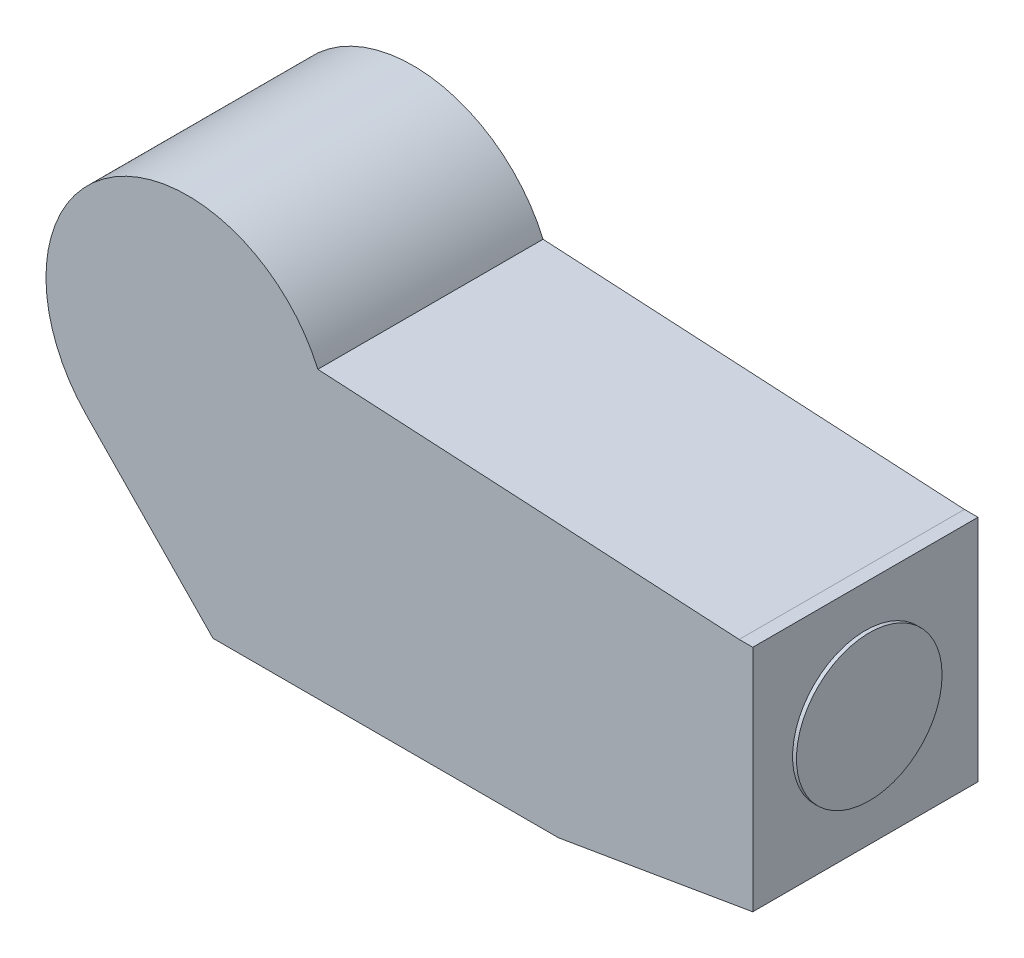
ISO-10303-21;
HEADER;
FILE_DESCRIPTION(('STEP AP214'),'2;1');
FILE_NAME('part.step','',(''),(''),'','','');
FILE_SCHEMA(('AUTOMOTIVE_DESIGN { 1 0 10303 214 1 1 1 1 }'));
ENDSEC;
DATA;
#1=APPLICATION_CONTEXT('core data for automotive mechanical design processes');
#2=APPLICATION_PROTOCOL_DEFINITION('international standard','automotive_design',2000,#1);
#3=PRODUCT_CONTEXT('',#1,'mechanical');
#4=PRODUCT('Part','Part','',(#3));
#5=PRODUCT_RELATED_PRODUCT_CATEGORY('part','',(#4));
#6=PRODUCT_DEFINITION_FORMATION('','',#4);
#7=PRODUCT_DEFINITION_CONTEXT('part definition',#1,'design');
#8=PRODUCT_DEFINITION('design','',#6,#7);
#9=PRODUCT_DEFINITION_SHAPE('','',#8);
#10=(LENGTH_UNIT() NAMED_UNIT(*) SI_UNIT(.MILLI.,.METRE.));
#11=(NAMED_UNIT(*) PLANE_ANGLE_UNIT() SI_UNIT($,.RADIAN.));
#12=(NAMED_UNIT(*) SI_UNIT($,.STERADIAN.) SOLID_ANGLE_UNIT());
#13=UNCERTAINTY_MEASURE_WITH_UNIT(LENGTH_MEASURE(1.E-05),#10,'distance_accuracy_value','');
#14=(GEOMETRIC_REPRESENTATION_CONTEXT(3) GLOBAL_UNCERTAINTY_ASSIGNED_CONTEXT((#13)) GLOBAL_UNIT_ASSIGNED_CONTEXT((#10,
#11,#12)) REPRESENTATION_CONTEXT('',''));
#15=CARTESIAN_POINT('',(0.,0.,0.));
#16=DIRECTION('',(0.,0.,1.));
#17=DIRECTION('',(1.,0.,0.));
#18=AXIS2_PLACEMENT_3D('',#15,#16,#17);
#19=CARTESIAN_POINT('',(0.,0.,58.));
#20=DIRECTION('',(0.,0.,-1.));
#21=DIRECTION('',(-1.,0.,0.));
#22=AXIS2_PLACEMENT_3D('',#19,#20,#21);
#23=CYLINDRICAL_SURFACE('',#22,73.);
#24=CARTESIAN_POINT('',(0.,0.,-58.));
#25=DIRECTION('',(0.,0.,1.));
#26=DIRECTION('',(1.,0.,0.));
#27=AXIS2_PLACEMENT_3D('',#24,#25,#26);
#28=CIRCLE('',#27,73.);
#29=CARTESIAN_POINT('',(67.,28.9827534923789,-58.));
#30=VERTEX_POINT('',#29);
#31=CARTESIAN_POINT('',(-52.3049225386602,-50.9234236695134,-58.));
#32=VERTEX_POINT('',#31);
#33=EDGE_CURVE('E126',#30,#32,#28,.T.);
#34=ORIENTED_EDGE('',*,*,#33,.T.);
#35=DIRECTION('',(0.,0.,-1.));
#36=VECTOR('',#35,1.);
#37=CARTESIAN_POINT('',(-52.3049225386602,-50.9234236695134,58.));
#38=LINE('',#37,#36);
#39=CARTESIAN_POINT('',(-52.3049225386602,-50.9234236695134,58.));
#40=VERTEX_POINT('',#39);
#41=EDGE_CURVE('E37',#40,#32,#38,.T.);
#42=ORIENTED_EDGE('',*,*,#41,.F.);
#43=CARTESIAN_POINT('',(0.,0.,58.));
#44=DIRECTION('',(0.,0.,1.));
#45=DIRECTION('',(1.,0.,0.));
#46=AXIS2_PLACEMENT_3D('',#43,#44,#45);
#47=CIRCLE('',#46,73.);
#48=CARTESIAN_POINT('',(67.,28.9827534923789,58.));
#49=VERTEX_POINT('',#48);
#50=EDGE_CURVE('E139',#49,#40,#47,.T.);
#51=ORIENTED_EDGE('',*,*,#50,.F.);
#52=DIRECTION('',(0.,0.,-1.));
#53=VECTOR('',#52,1.);
#54=CARTESIAN_POINT('',(67.,28.9827534923789,58.));
#55=LINE('',#54,#53);
#56=EDGE_CURVE('E122',#49,#30,#55,.T.);
#57=ORIENTED_EDGE('',*,*,#56,.T.);
#58=EDGE_LOOP('',(#34,#42,#51,#57));
#59=FACE_BOUND('',#58,.T.);
#60=ADVANCED_FACE('F34',(#59),#23,.T.);
#61=CARTESIAN_POINT('',(13.,-118.,58.));
#62=DIRECTION('',(0.716505788200825,0.697581146157718,0.));
#63=DIRECTION('',(-0.697581146157718,0.716505788200825,0.));
#64=AXIS2_PLACEMENT_3D('',#61,#62,#63);
#65=PLANE('',#64);
#66=DIRECTION('',(0.697581146157718,-0.716505788200824,0.));
#67=VECTOR('',#66,1.);
#68=CARTESIAN_POINT('',(13.,-118.,-58.));
#69=LINE('',#68,#67);
#70=CARTESIAN_POINT('',(13.,-118.,-58.));
#71=VERTEX_POINT('',#70);
#72=EDGE_CURVE('E129',#32,#71,#69,.T.);
#73=ORIENTED_EDGE('',*,*,#72,.T.);
#74=DIRECTION('',(0.,0.,-1.));
#75=VECTOR('',#74,1.);
#76=CARTESIAN_POINT('',(13.,-118.,58.));
#77=LINE('',#76,#75);
#78=CARTESIAN_POINT('',(13.,-118.,58.));
#79=VERTEX_POINT('',#78);
#80=EDGE_CURVE('E145',#79,#71,#77,.T.);
#81=ORIENTED_EDGE('',*,*,#80,.F.);
#82=DIRECTION('',(0.697581146157718,-0.716505788200824,0.));
#83=VECTOR('',#82,1.);
#84=CARTESIAN_POINT('',(13.,-118.,58.));
#85=LINE('',#84,#83);
#86=EDGE_CURVE('E92',#40,#79,#85,.T.);
#87=ORIENTED_EDGE('',*,*,#86,.F.);
#88=ORIENTED_EDGE('',*,*,#41,.T.);
#89=EDGE_LOOP('',(#73,#81,#87,#88));
#90=FACE_BOUND('',#89,.T.);
#91=ADVANCED_FACE('F151',(#90),#65,.F.);
#92=CARTESIAN_POINT('',(191.,-118.,58.));
#93=DIRECTION('',(0.,1.,0.));
#94=DIRECTION('',(-1.,0.,0.));
#95=AXIS2_PLACEMENT_3D('',#92,#93,#94);
#96=PLANE('',#95);
#97=DIRECTION('',(1.,0.,0.));
#98=VECTOR('',#97,1.);
#99=CARTESIAN_POINT('',(191.,-118.,-58.));
#100=LINE('',#99,#98);
#101=CARTESIAN_POINT('',(191.,-118.,-58.));
#102=VERTEX_POINT('',#101);
#103=EDGE_CURVE('E132',#71,#102,#100,.T.);
#104=ORIENTED_EDGE('',*,*,#103,.T.);
#105=DIRECTION('',(0.,0.,-1.));
#106=VECTOR('',#105,1.);
#107=CARTESIAN_POINT('',(191.,-118.,58.));
#108=LINE('',#107,#106);
#109=CARTESIAN_POINT('',(191.,-118.,58.));
#110=VERTEX_POINT('',#109);
#111=EDGE_CURVE('E143',#110,#102,#108,.T.);
#112=ORIENTED_EDGE('',*,*,#111,.F.);
#113=DIRECTION('',(1.,0.,0.));
#114=VECTOR('',#113,1.);
#115=CARTESIAN_POINT('',(191.,-118.,58.));
#116=LINE('',#115,#114);
#117=EDGE_CURVE('E162',#79,#110,#116,.T.);
#118=ORIENTED_EDGE('',*,*,#117,.F.);
#119=ORIENTED_EDGE('',*,*,#80,.T.);
#120=EDGE_LOOP('',(#104,#112,#118,#119));
#121=FACE_BOUND('',#120,.T.);
#122=ADVANCED_FACE('F159',(#121),#96,.F.);
#123=CARTESIAN_POINT('',(291.,-101.,58.));
#124=DIRECTION('',(-0.167595493933869,0.985855846669817,0.));
#125=DIRECTION('',(-0.985855846669817,-0.167595493933869,0.));
#126=AXIS2_PLACEMENT_3D('',#123,#124,#125);
#127=PLANE('',#126);
#128=DIRECTION('',(0.985855846669817,0.167595493933869,0.));
#129=VECTOR('',#128,1.);
#130=CARTESIAN_POINT('',(291.,-101.,-58.));
#131=LINE('',#130,#129);
#132=CARTESIAN_POINT('',(291.,-101.,-58.));
#133=VERTEX_POINT('',#132);
#134=EDGE_CURVE('E134',#102,#133,#131,.T.);
#135=ORIENTED_EDGE('',*,*,#134,.T.);
#136=DIRECTION('',(0.,0.,-1.));
#137=VECTOR('',#136,1.);
#138=CARTESIAN_POINT('',(291.,-101.,58.));
#139=LINE('',#138,#137);
#140=CARTESIAN_POINT('',(291.,-101.,58.));
#141=VERTEX_POINT('',#140);
#142=EDGE_CURVE('E117',#141,#133,#139,.T.);
#143=ORIENTED_EDGE('',*,*,#142,.F.);
#144=DIRECTION('',(0.985855846669817,0.167595493933869,0.));
#145=VECTOR('',#144,1.);
#146=CARTESIAN_POINT('',(291.,-101.,58.));
#147=LINE('',#146,#145);
#148=EDGE_CURVE('E108',#110,#141,#147,.T.);
#149=ORIENTED_EDGE('',*,*,#148,.F.);
#150=ORIENTED_EDGE('',*,*,#111,.T.);
#151=EDGE_LOOP('',(#135,#143,#149,#150));
#152=FACE_BOUND('',#151,.T.);
#153=ADVANCED_FACE('F161',(#152),#127,.F.);
#154=CARTESIAN_POINT('',(291.,17.,58.));
#155=DIRECTION('',(-1.,0.,0.));
#156=DIRECTION('',(0.,0.,1.));
#157=AXIS2_PLACEMENT_3D('',#154,#155,#156);
#158=PLANE('',#157);
#159=CARTESIAN_POINT('',(291.,-42.,0.));
#160=DIRECTION('',(1.,0.,0.));
#161=DIRECTION('',(0.,0.,-1.));
#162=AXIS2_PLACEMENT_3D('',#159,#160,#161);
#163=CIRCLE('',#162,37.5);
#164=CARTESIAN_POINT('',(291.,-42.,-37.5));
#165=VERTEX_POINT('',#164);
#166=EDGE_CURVE('E11',#165,#165,#163,.T.);
#167=ORIENTED_EDGE('',*,*,#166,.F.);
#168=EDGE_LOOP('',(#167));
#169=FACE_BOUND('',#168,.T.);
#170=DIRECTION('',(0.,1.,0.));
#171=VECTOR('',#170,1.);
#172=CARTESIAN_POINT('',(291.,17.,-58.));
#173=LINE('',#172,#171);
#174=CARTESIAN_POINT('',(291.,17.,-58.));
#175=VERTEX_POINT('',#174);
#176=EDGE_CURVE('E116',#133,#175,#173,.T.);
#177=ORIENTED_EDGE('',*,*,#176,.T.);
#178=DIRECTION('',(0.,0.,-1.));
#179=VECTOR('',#178,1.);
#180=CARTESIAN_POINT('',(291.,17.,58.));
#181=LINE('',#180,#179);
#182=CARTESIAN_POINT('',(291.,17.,58.));
#183=VERTEX_POINT('',#182);
#184=EDGE_CURVE('E113',#183,#175,#181,.T.);
#185=ORIENTED_EDGE('',*,*,#184,.F.);
#186=DIRECTION('',(0.,1.,0.));
#187=VECTOR('',#186,1.);
#188=CARTESIAN_POINT('',(291.,17.,58.));
#189=LINE('',#188,#187);
#190=EDGE_CURVE('E102',#141,#183,#189,.T.);
#191=ORIENTED_EDGE('',*,*,#190,.F.);
#192=ORIENTED_EDGE('',*,*,#142,.T.);
#193=EDGE_LOOP('',(#177,#185,#191,#192));
#194=FACE_BOUND('',#193,.T.);
#195=ADVANCED_FACE('F114',(#169,#194),#158,.F.);
#196=CARTESIAN_POINT('',(284.,17.,58.));
#197=DIRECTION('',(0.,-1.,0.));
#198=DIRECTION('',(0.,0.,-1.));
#199=AXIS2_PLACEMENT_3D('',#196,#197,#198);
#200=PLANE('',#199);
#201=DIRECTION('',(-1.,0.,0.));
#202=VECTOR('',#201,1.);
#203=CARTESIAN_POINT('',(284.,17.,-58.));
#204=LINE('',#203,#202);
#205=CARTESIAN_POINT('',(284.,17.,-58.));
#206=VERTEX_POINT('',#205);
#207=EDGE_CURVE('E77',#175,#206,#204,.T.);
#208=ORIENTED_EDGE('',*,*,#207,.T.);
#209=DIRECTION('',(0.,0.,-1.));
#210=VECTOR('',#209,1.);
#211=CARTESIAN_POINT('',(284.,17.,58.));
#212=LINE('',#211,#210);
#213=CARTESIAN_POINT('',(284.,17.,58.));
#214=VERTEX_POINT('',#213);
#215=EDGE_CURVE('E118',#214,#206,#212,.T.);
#216=ORIENTED_EDGE('',*,*,#215,.F.);
#217=DIRECTION('',(-1.,0.,0.));
#218=VECTOR('',#217,1.);
#219=CARTESIAN_POINT('',(284.,17.,58.));
#220=LINE('',#219,#218);
#221=EDGE_CURVE('E106',#183,#214,#220,.T.);
#222=ORIENTED_EDGE('',*,*,#221,.F.);
#223=ORIENTED_EDGE('',*,*,#184,.T.);
#224=EDGE_LOOP('',(#208,#216,#222,#223));
#225=FACE_BOUND('',#224,.T.);
#226=ADVANCED_FACE('F120',(#225),#200,.F.);
#227=CARTESIAN_POINT('',(67.,28.9827534923789,58.));
#228=DIRECTION('',(-0.0551360641938782,-0.998478850264345,0.));
#229=DIRECTION('',(0.998478850264345,-0.0551360641938782,0.));
#230=AXIS2_PLACEMENT_3D('',#227,#228,#229);
#231=PLANE('',#230);
#232=DIRECTION('',(-0.998478850264345,0.0551360641938782,0.));
#233=VECTOR('',#232,1.);
#234=CARTESIAN_POINT('',(67.,28.9827534923789,-58.));
#235=LINE('',#234,#233);
#236=EDGE_CURVE('E83',#206,#30,#235,.T.);
#237=ORIENTED_EDGE('',*,*,#236,.T.);
#238=ORIENTED_EDGE('',*,*,#56,.F.);
#239=DIRECTION('',(-0.998478850264345,0.0551360641938782,0.));
#240=VECTOR('',#239,1.);
#241=CARTESIAN_POINT('',(67.,28.9827534923789,58.));
#242=LINE('',#241,#240);
#243=EDGE_CURVE('E51',#214,#49,#242,.T.);
#244=ORIENTED_EDGE('',*,*,#243,.F.);
#245=ORIENTED_EDGE('',*,*,#215,.T.);
#246=EDGE_LOOP('',(#237,#238,#244,#245));
#247=FACE_BOUND('',#246,.T.);
#248=ADVANCED_FACE('F184',(#247),#231,.F.);
#249=CARTESIAN_POINT('',(0.,0.,58.));
#250=DIRECTION('',(0.,0.,1.));
#251=DIRECTION('',(1.,0.,0.));
#252=AXIS2_PLACEMENT_3D('',#249,#250,#251);
#253=PLANE('',#252);
#254=ORIENTED_EDGE('',*,*,#50,.T.);
#255=ORIENTED_EDGE('',*,*,#86,.T.);
#256=ORIENTED_EDGE('',*,*,#117,.T.);
#257=ORIENTED_EDGE('',*,*,#148,.T.);
#258=ORIENTED_EDGE('',*,*,#190,.T.);
#259=ORIENTED_EDGE('',*,*,#221,.T.);
#260=ORIENTED_EDGE('',*,*,#243,.T.);
#261=EDGE_LOOP('',(#254,#255,#256,#257,#258,#259,#260));
#262=FACE_BOUND('',#261,.T.);
#263=ADVANCED_FACE('F104',(#262),#253,.T.);
#264=CARTESIAN_POINT('',(0.,0.,-58.));
#265=DIRECTION('',(0.,0.,1.));
#266=DIRECTION('',(1.,0.,0.));
#267=AXIS2_PLACEMENT_3D('',#264,#265,#266);
#268=PLANE('',#267);
#269=ORIENTED_EDGE('',*,*,#33,.F.);
#270=ORIENTED_EDGE('',*,*,#236,.F.);
#271=ORIENTED_EDGE('',*,*,#207,.F.);
#272=ORIENTED_EDGE('',*,*,#176,.F.);
#273=ORIENTED_EDGE('',*,*,#134,.F.);
#274=ORIENTED_EDGE('',*,*,#103,.F.);
#275=ORIENTED_EDGE('',*,*,#72,.F.);
#276=EDGE_LOOP('',(#269,#270,#271,#272,#273,#274,#275));
#277=FACE_BOUND('',#276,.T.);
#278=ADVANCED_FACE('F156',(#277),#268,.F.);
#279=CARTESIAN_POINT('',(293.,-42.,0.));
#280=DIRECTION('',(-1.,0.,0.));
#281=DIRECTION('',(0.,0.,1.));
#282=AXIS2_PLACEMENT_3D('',#279,#280,#281);
#283=CYLINDRICAL_SURFACE('',#282,37.5);
#284=CARTESIAN_POINT('',(293.,-42.,0.));
#285=DIRECTION('',(1.,0.,0.));
#286=DIRECTION('',(0.,0.,-1.));
#287=AXIS2_PLACEMENT_3D('',#284,#285,#286);
#288=CIRCLE('',#287,37.5);
#289=CARTESIAN_POINT('',(293.,-42.,-37.5));
#290=VERTEX_POINT('',#289);
#291=EDGE_CURVE('E130',#290,#290,#288,.T.);
#292=ORIENTED_EDGE('',*,*,#291,.F.);
#293=EDGE_LOOP('',(#292));
#294=FACE_BOUND('',#293,.T.);
#295=ORIENTED_EDGE('',*,*,#166,.T.);
#296=EDGE_LOOP('',(#295));
#297=FACE_BOUND('',#296,.T.);
#298=ADVANCED_FACE('F172',(#294,#297),#283,.T.);
#299=CARTESIAN_POINT('',(293.,-42.,0.));
#300=DIRECTION('',(1.,0.,0.));
#301=DIRECTION('',(0.,0.,-1.));
#302=AXIS2_PLACEMENT_3D('',#299,#300,#301);
#303=PLANE('',#302);
#304=ORIENTED_EDGE('',*,*,#291,.T.);
#305=EDGE_LOOP('',(#304));
#306=FACE_BOUND('',#305,.T.);
#307=ADVANCED_FACE('F170',(#306),#303,.T.);
#308=CLOSED_SHELL('',(#60,#91,#122,#153,#195,#226,#248,#263,#278,#298,#307));
#309=MANIFOLD_SOLID_BREP('B2',#308);
#310=ADVANCED_BREP_SHAPE_REPRESENTATION('',(#18,#309),#14);
#311=SHAPE_DEFINITION_REPRESENTATION(#9,#310);
ENDSEC;
END-ISO-10303-21;
